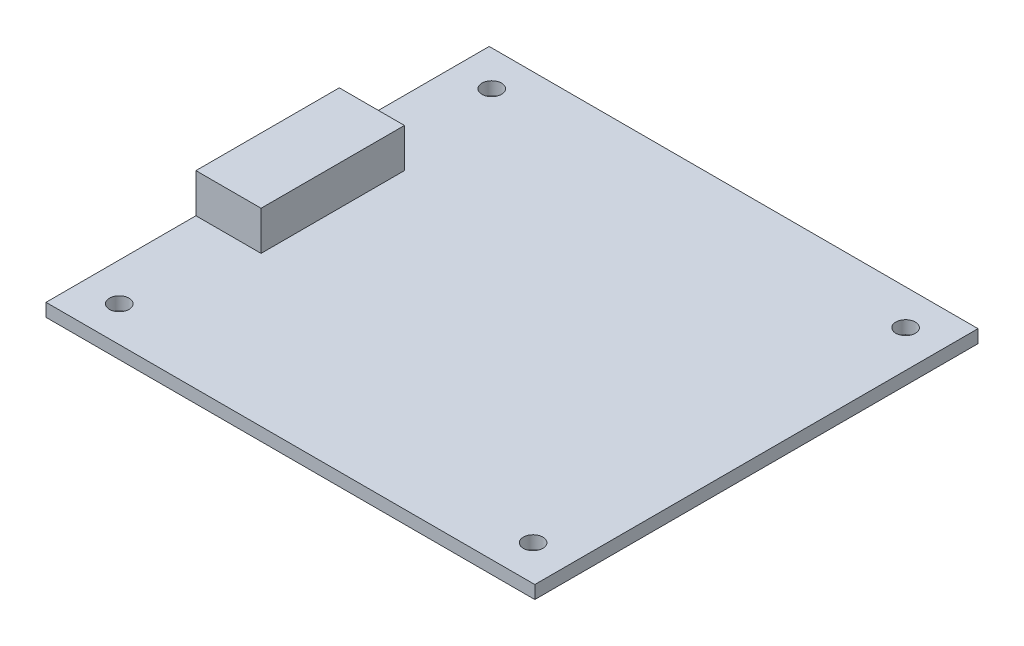
ISO-10303-21;
HEADER;
FILE_DESCRIPTION(('STEP AP214'),'2;1');
FILE_NAME('part.step','',(''),(''),'','','');
FILE_SCHEMA(('AUTOMOTIVE_DESIGN { 1 0 10303 214 1 1 1 1 }'));
ENDSEC;
DATA;
#1=APPLICATION_CONTEXT('core data for automotive mechanical design processes');
#2=APPLICATION_PROTOCOL_DEFINITION('international standard','automotive_design',2000,#1);
#3=PRODUCT_CONTEXT('',#1,'mechanical');
#4=PRODUCT('Part','Part','',(#3));
#5=PRODUCT_RELATED_PRODUCT_CATEGORY('part','',(#4));
#6=PRODUCT_DEFINITION_FORMATION('','',#4);
#7=PRODUCT_DEFINITION_CONTEXT('part definition',#1,'design');
#8=PRODUCT_DEFINITION('design','',#6,#7);
#9=PRODUCT_DEFINITION_SHAPE('','',#8);
#10=(LENGTH_UNIT() NAMED_UNIT(*) SI_UNIT(.MILLI.,.METRE.));
#11=(NAMED_UNIT(*) PLANE_ANGLE_UNIT() SI_UNIT($,.RADIAN.));
#12=(NAMED_UNIT(*) SI_UNIT($,.STERADIAN.) SOLID_ANGLE_UNIT());
#13=UNCERTAINTY_MEASURE_WITH_UNIT(LENGTH_MEASURE(1.E-05),#10,'distance_accuracy_value','');
#14=(GEOMETRIC_REPRESENTATION_CONTEXT(3) GLOBAL_UNCERTAINTY_ASSIGNED_CONTEXT((#13)) GLOBAL_UNIT_ASSIGNED_CONTEXT((#10,
#11,#12)) REPRESENTATION_CONTEXT('',''));
#15=CARTESIAN_POINT('',(0.,0.,0.));
#16=DIRECTION('',(0.,0.,1.));
#17=DIRECTION('',(1.,0.,0.));
#18=AXIS2_PLACEMENT_3D('',#15,#16,#17);
#19=CARTESIAN_POINT('',(0.,2.,0.));
#20=DIRECTION('',(0.,-1.,0.));
#21=DIRECTION('',(0.,0.,-1.));
#22=AXIS2_PLACEMENT_3D('',#19,#20,#21);
#23=PLANE('',#22);
#24=CARTESIAN_POINT('',(-31.6865,2.,28.5750000000001));
#25=DIRECTION('',(0.,1.,0.));
#26=DIRECTION('',(0.,0.,1.));
#27=AXIS2_PLACEMENT_3D('',#24,#25,#26);
#28=CIRCLE('',#27,1.5);
#29=CARTESIAN_POINT('',(-31.6865,2.,30.0750000000001));
#30=VERTEX_POINT('',#29);
#31=EDGE_CURVE('E129',#30,#30,#28,.T.);
#32=ORIENTED_EDGE('',*,*,#31,.F.);
#33=EDGE_LOOP('',(#32));
#34=FACE_BOUND('',#33,.T.);
#35=CARTESIAN_POINT('',(-31.6865000000001,2.,-28.5749999999999));
#36=DIRECTION('',(0.,1.,0.));
#37=DIRECTION('',(0.,0.,1.));
#38=AXIS2_PLACEMENT_3D('',#35,#36,#37);
#39=CIRCLE('',#38,1.5);
#40=CARTESIAN_POINT('',(-31.6865000000001,2.,-27.0749999999999));
#41=VERTEX_POINT('',#40);
#42=EDGE_CURVE('E135',#41,#41,#39,.T.);
#43=ORIENTED_EDGE('',*,*,#42,.F.);
#44=EDGE_LOOP('',(#43));
#45=FACE_BOUND('',#44,.T.);
#46=CARTESIAN_POINT('',(31.8135000000001,2.,28.5749999999999));
#47=DIRECTION('',(0.,1.,0.));
#48=DIRECTION('',(0.,0.,1.));
#49=AXIS2_PLACEMENT_3D('',#46,#47,#48);
#50=CIRCLE('',#49,1.5);
#51=CARTESIAN_POINT('',(31.8135000000001,2.,30.0749999999999));
#52=VERTEX_POINT('',#51);
#53=EDGE_CURVE('E141',#52,#52,#50,.T.);
#54=ORIENTED_EDGE('',*,*,#53,.F.);
#55=EDGE_LOOP('',(#54));
#56=FACE_BOUND('',#55,.T.);
#57=CARTESIAN_POINT('',(31.8134999999999,2.,-28.5750000000001));
#58=DIRECTION('',(0.,1.,0.));
#59=DIRECTION('',(0.,0.,1.));
#60=AXIS2_PLACEMENT_3D('',#57,#58,#59);
#61=CIRCLE('',#60,1.5);
#62=CARTESIAN_POINT('',(31.8134999999999,2.,-27.0750000000001));
#63=VERTEX_POINT('',#62);
#64=EDGE_CURVE('E147',#63,#63,#61,.T.);
#65=ORIENTED_EDGE('',*,*,#64,.F.);
#66=EDGE_LOOP('',(#65));
#67=FACE_BOUND('',#66,.T.);
#68=DIRECTION('',(1.,0.,0.));
#69=VECTOR('',#68,1.);
#70=CARTESIAN_POINT('',(-37.5,2.,11.));
#71=LINE('',#70,#69);
#72=CARTESIAN_POINT('',(-37.5,2.,11.));
#73=VERTEX_POINT('',#72);
#74=CARTESIAN_POINT('',(-27.5,2.,11.));
#75=VERTEX_POINT('',#74);
#76=EDGE_CURVE('E114',#73,#75,#71,.T.);
#77=ORIENTED_EDGE('',*,*,#76,.F.);
#78=DIRECTION('',(0.,0.,1.));
#79=VECTOR('',#78,1.);
#80=CARTESIAN_POINT('',(-37.5,2.,34.));
#81=LINE('',#80,#79);
#82=CARTESIAN_POINT('',(-37.5,2.,34.));
#83=VERTEX_POINT('',#82);
#84=EDGE_CURVE('E159',#73,#83,#81,.T.);
#85=ORIENTED_EDGE('',*,*,#84,.T.);
#86=DIRECTION('',(1.,0.,0.));
#87=VECTOR('',#86,1.);
#88=CARTESIAN_POINT('',(-37.5,2.,34.));
#89=LINE('',#88,#87);
#90=CARTESIAN_POINT('',(37.5,2.,34.));
#91=VERTEX_POINT('',#90);
#92=EDGE_CURVE('E162',#83,#91,#89,.T.);
#93=ORIENTED_EDGE('',*,*,#92,.T.);
#94=DIRECTION('',(0.,0.,-1.));
#95=VECTOR('',#94,1.);
#96=CARTESIAN_POINT('',(37.5,2.,34.));
#97=LINE('',#96,#95);
#98=CARTESIAN_POINT('',(37.5,2.,-34.));
#99=VERTEX_POINT('',#98);
#100=EDGE_CURVE('E153',#91,#99,#97,.T.);
#101=ORIENTED_EDGE('',*,*,#100,.T.);
#102=DIRECTION('',(-1.,0.,0.));
#103=VECTOR('',#102,1.);
#104=CARTESIAN_POINT('',(-37.5,2.,-34.));
#105=LINE('',#104,#103);
#106=CARTESIAN_POINT('',(-37.5,2.,-34.));
#107=VERTEX_POINT('',#106);
#108=EDGE_CURVE('E156',#99,#107,#105,.T.);
#109=ORIENTED_EDGE('',*,*,#108,.T.);
#110=CARTESIAN_POINT('',(-37.5,2.,-11.));
#111=VERTEX_POINT('',#110);
#112=EDGE_CURVE('E160',#107,#111,#81,.T.);
#113=ORIENTED_EDGE('',*,*,#112,.T.);
#114=DIRECTION('',(-1.,0.,0.));
#115=VECTOR('',#114,1.);
#116=CARTESIAN_POINT('',(-37.5,2.,-11.));
#117=LINE('',#116,#115);
#118=CARTESIAN_POINT('',(-27.5,2.,-11.));
#119=VERTEX_POINT('',#118);
#120=EDGE_CURVE('E52',#119,#111,#117,.T.);
#121=ORIENTED_EDGE('',*,*,#120,.F.);
#122=DIRECTION('',(0.,0.,-1.));
#123=VECTOR('',#122,1.);
#124=CARTESIAN_POINT('',(-27.5,2.,11.));
#125=LINE('',#124,#123);
#126=EDGE_CURVE('E47',#75,#119,#125,.T.);
#127=ORIENTED_EDGE('',*,*,#126,.F.);
#128=EDGE_LOOP('',(#77,#85,#93,#101,#109,#113,#121,#127));
#129=FACE_BOUND('',#128,.T.);
#130=ADVANCED_FACE('F32',(#34,#45,#56,#67,#129),#23,.F.);
#131=CARTESIAN_POINT('',(0.,0.,0.));
#132=DIRECTION('',(0.,-1.,0.));
#133=DIRECTION('',(0.,0.,-1.));
#134=AXIS2_PLACEMENT_3D('',#131,#132,#133);
#135=PLANE('',#134);
#136=CARTESIAN_POINT('',(-21.7439228681575,0.,-7.92747187901575));
#137=DIRECTION('',(0.,-1.,0.));
#138=DIRECTION('',(0.,0.,-1.));
#139=AXIS2_PLACEMENT_3D('',#136,#137,#138);
#140=CIRCLE('',#139,2.);
#141=CARTESIAN_POINT('',(-21.7439228681575,0.,-9.92747187901576));
#142=VERTEX_POINT('',#141);
#143=EDGE_CURVE('E117',#142,#142,#140,.T.);
#144=ORIENTED_EDGE('',*,*,#143,.F.);
#145=EDGE_LOOP('',(#144));
#146=FACE_BOUND('',#145,.T.);
#147=CARTESIAN_POINT('',(-21.5929234037953,0.,0.));
#148=DIRECTION('',(0.,-1.,0.));
#149=DIRECTION('',(0.,0.,-1.));
#150=AXIS2_PLACEMENT_3D('',#147,#148,#149);
#151=CIRCLE('',#150,3.);
#152=CARTESIAN_POINT('',(-21.5929234037953,0.,-3.));
#153=VERTEX_POINT('',#152);
#154=EDGE_CURVE('E120',#153,#153,#151,.T.);
#155=ORIENTED_EDGE('',*,*,#154,.F.);
#156=EDGE_LOOP('',(#155));
#157=FACE_BOUND('',#156,.T.);
#158=CARTESIAN_POINT('',(-31.6865000000001,0.,-28.5749999999999));
#159=DIRECTION('',(0.,1.,0.));
#160=DIRECTION('',(0.,0.,1.));
#161=AXIS2_PLACEMENT_3D('',#158,#159,#160);
#162=CIRCLE('',#161,1.5);
#163=CARTESIAN_POINT('',(-31.6865000000001,0.,-27.0749999999999));
#164=VERTEX_POINT('',#163);
#165=EDGE_CURVE('E132',#164,#164,#162,.T.);
#166=ORIENTED_EDGE('',*,*,#165,.T.);
#167=EDGE_LOOP('',(#166));
#168=FACE_BOUND('',#167,.T.);
#169=CARTESIAN_POINT('',(31.8134999999999,0.,-28.5750000000001));
#170=DIRECTION('',(0.,1.,0.));
#171=DIRECTION('',(0.,0.,1.));
#172=AXIS2_PLACEMENT_3D('',#169,#170,#171);
#173=CIRCLE('',#172,1.5);
#174=CARTESIAN_POINT('',(31.8134999999999,0.,-27.0750000000001));
#175=VERTEX_POINT('',#174);
#176=EDGE_CURVE('E144',#175,#175,#173,.T.);
#177=ORIENTED_EDGE('',*,*,#176,.T.);
#178=EDGE_LOOP('',(#177));
#179=FACE_BOUND('',#178,.T.);
#180=DIRECTION('',(0.,0.,-1.));
#181=VECTOR('',#180,1.);
#182=CARTESIAN_POINT('',(37.5,0.,34.));
#183=LINE('',#182,#181);
#184=CARTESIAN_POINT('',(37.5,0.,34.));
#185=VERTEX_POINT('',#184);
#186=CARTESIAN_POINT('',(37.5,0.,-34.));
#187=VERTEX_POINT('',#186);
#188=EDGE_CURVE('E150',#185,#187,#183,.T.);
#189=ORIENTED_EDGE('',*,*,#188,.F.);
#190=DIRECTION('',(1.,0.,0.));
#191=VECTOR('',#190,1.);
#192=CARTESIAN_POINT('',(-37.5,0.,34.));
#193=LINE('',#192,#191);
#194=CARTESIAN_POINT('',(-37.5,0.,34.));
#195=VERTEX_POINT('',#194);
#196=EDGE_CURVE('E157',#195,#185,#193,.T.);
#197=ORIENTED_EDGE('',*,*,#196,.F.);
#198=DIRECTION('',(0.,0.,1.));
#199=VECTOR('',#198,1.);
#200=CARTESIAN_POINT('',(-37.5,0.,34.));
#201=LINE('',#200,#199);
#202=CARTESIAN_POINT('',(-37.5,0.,-34.));
#203=VERTEX_POINT('',#202);
#204=EDGE_CURVE('E169',#203,#195,#201,.T.);
#205=ORIENTED_EDGE('',*,*,#204,.F.);
#206=DIRECTION('',(-1.,0.,0.));
#207=VECTOR('',#206,1.);
#208=CARTESIAN_POINT('',(-37.5,0.,-34.));
#209=LINE('',#208,#207);
#210=EDGE_CURVE('E167',#187,#203,#209,.T.);
#211=ORIENTED_EDGE('',*,*,#210,.F.);
#212=EDGE_LOOP('',(#189,#197,#205,#211));
#213=FACE_BOUND('',#212,.T.);
#214=CARTESIAN_POINT('',(31.8135000000001,0.,28.5749999999999));
#215=DIRECTION('',(0.,1.,0.));
#216=DIRECTION('',(0.,0.,1.));
#217=AXIS2_PLACEMENT_3D('',#214,#215,#216);
#218=CIRCLE('',#217,1.5);
#219=CARTESIAN_POINT('',(31.8135000000001,0.,30.0749999999999));
#220=VERTEX_POINT('',#219);
#221=EDGE_CURVE('E138',#220,#220,#218,.T.);
#222=ORIENTED_EDGE('',*,*,#221,.T.);
#223=EDGE_LOOP('',(#222));
#224=FACE_BOUND('',#223,.T.);
#225=CARTESIAN_POINT('',(-31.6865,0.,28.5750000000001));
#226=DIRECTION('',(0.,1.,0.));
#227=DIRECTION('',(0.,0.,1.));
#228=AXIS2_PLACEMENT_3D('',#225,#226,#227);
#229=CIRCLE('',#228,1.5);
#230=CARTESIAN_POINT('',(-31.6865,0.,30.0750000000001));
#231=VERTEX_POINT('',#230);
#232=EDGE_CURVE('E128',#231,#231,#229,.T.);
#233=ORIENTED_EDGE('',*,*,#232,.T.);
#234=EDGE_LOOP('',(#233));
#235=FACE_BOUND('',#234,.T.);
#236=ADVANCED_FACE('F205',(#146,#157,#168,#179,#213,#224,#235),#135,.T.);
#237=CARTESIAN_POINT('',(37.5,2.,34.));
#238=DIRECTION('',(-1.,0.,0.));
#239=DIRECTION('',(0.,0.,1.));
#240=AXIS2_PLACEMENT_3D('',#237,#238,#239);
#241=PLANE('',#240);
#242=ORIENTED_EDGE('',*,*,#188,.T.);
#243=DIRECTION('',(0.,-1.,0.));
#244=VECTOR('',#243,1.);
#245=CARTESIAN_POINT('',(37.5,2.,-34.));
#246=LINE('',#245,#244);
#247=EDGE_CURVE('E180',#99,#187,#246,.T.);
#248=ORIENTED_EDGE('',*,*,#247,.F.);
#249=ORIENTED_EDGE('',*,*,#100,.F.);
#250=DIRECTION('',(0.,-1.,0.));
#251=VECTOR('',#250,1.);
#252=CARTESIAN_POINT('',(37.5,2.,34.));
#253=LINE('',#252,#251);
#254=EDGE_CURVE('E164',#91,#185,#253,.T.);
#255=ORIENTED_EDGE('',*,*,#254,.T.);
#256=EDGE_LOOP('',(#242,#248,#249,#255));
#257=FACE_BOUND('',#256,.T.);
#258=ADVANCED_FACE('F211',(#257),#241,.F.);
#259=CARTESIAN_POINT('',(-37.5,2.,-34.));
#260=DIRECTION('',(0.,0.,1.));
#261=DIRECTION('',(1.,0.,0.));
#262=AXIS2_PLACEMENT_3D('',#259,#260,#261);
#263=PLANE('',#262);
#264=ORIENTED_EDGE('',*,*,#210,.T.);
#265=DIRECTION('',(0.,-1.,0.));
#266=VECTOR('',#265,1.);
#267=CARTESIAN_POINT('',(-37.5,2.,-34.));
#268=LINE('',#267,#266);
#269=EDGE_CURVE('E177',#107,#203,#268,.T.);
#270=ORIENTED_EDGE('',*,*,#269,.F.);
#271=ORIENTED_EDGE('',*,*,#108,.F.);
#272=ORIENTED_EDGE('',*,*,#247,.T.);
#273=EDGE_LOOP('',(#264,#270,#271,#272));
#274=FACE_BOUND('',#273,.T.);
#275=ADVANCED_FACE('F227',(#274),#263,.F.);
#276=CARTESIAN_POINT('',(-37.5,2.,34.));
#277=DIRECTION('',(1.,0.,0.));
#278=DIRECTION('',(0.,0.,-1.));
#279=AXIS2_PLACEMENT_3D('',#276,#277,#278);
#280=PLANE('',#279);
#281=ORIENTED_EDGE('',*,*,#204,.T.);
#282=DIRECTION('',(0.,-1.,0.));
#283=VECTOR('',#282,1.);
#284=CARTESIAN_POINT('',(-37.5,2.,34.));
#285=LINE('',#284,#283);
#286=EDGE_CURVE('E174',#83,#195,#285,.T.);
#287=ORIENTED_EDGE('',*,*,#286,.F.);
#288=ORIENTED_EDGE('',*,*,#84,.F.);
#289=DIRECTION('',(0.,-1.,0.));
#290=VECTOR('',#289,1.);
#291=CARTESIAN_POINT('',(-37.5,8.,11.));
#292=LINE('',#291,#290);
#293=CARTESIAN_POINT('',(-37.5,8.,11.));
#294=VERTEX_POINT('',#293);
#295=EDGE_CURVE('E122',#294,#73,#292,.T.);
#296=ORIENTED_EDGE('',*,*,#295,.F.);
#297=DIRECTION('',(0.,0.,1.));
#298=VECTOR('',#297,1.);
#299=CARTESIAN_POINT('',(-37.5,8.,11.));
#300=LINE('',#299,#298);
#301=CARTESIAN_POINT('',(-37.5,8.,-11.));
#302=VERTEX_POINT('',#301);
#303=EDGE_CURVE('E104',#302,#294,#300,.T.);
#304=ORIENTED_EDGE('',*,*,#303,.F.);
#305=DIRECTION('',(0.,-1.,0.));
#306=VECTOR('',#305,1.);
#307=CARTESIAN_POINT('',(-37.5,8.,-11.));
#308=LINE('',#307,#306);
#309=EDGE_CURVE('E101',#302,#111,#308,.T.);
#310=ORIENTED_EDGE('',*,*,#309,.T.);
#311=ORIENTED_EDGE('',*,*,#112,.F.);
#312=ORIENTED_EDGE('',*,*,#269,.T.);
#313=EDGE_LOOP('',(#281,#287,#288,#296,#304,#310,#311,#312));
#314=FACE_BOUND('',#313,.T.);
#315=ADVANCED_FACE('F223',(#314),#280,.F.);
#316=CARTESIAN_POINT('',(-37.5,2.,34.));
#317=DIRECTION('',(0.,0.,-1.));
#318=DIRECTION('',(-1.,0.,0.));
#319=AXIS2_PLACEMENT_3D('',#316,#317,#318);
#320=PLANE('',#319);
#321=ORIENTED_EDGE('',*,*,#196,.T.);
#322=ORIENTED_EDGE('',*,*,#254,.F.);
#323=ORIENTED_EDGE('',*,*,#92,.F.);
#324=ORIENTED_EDGE('',*,*,#286,.T.);
#325=EDGE_LOOP('',(#321,#322,#323,#324));
#326=FACE_BOUND('',#325,.T.);
#327=ADVANCED_FACE('F220',(#326),#320,.F.);
#328=CARTESIAN_POINT('',(31.8134999999999,2.,-28.5750000000001));
#329=DIRECTION('',(0.,-1.,0.));
#330=DIRECTION('',(0.,0.,-1.));
#331=AXIS2_PLACEMENT_3D('',#328,#329,#330);
#332=CYLINDRICAL_SURFACE('',#331,1.5);
#333=ORIENTED_EDGE('',*,*,#64,.T.);
#334=EDGE_LOOP('',(#333));
#335=FACE_BOUND('',#334,.T.);
#336=ORIENTED_EDGE('',*,*,#176,.F.);
#337=EDGE_LOOP('',(#336));
#338=FACE_BOUND('',#337,.T.);
#339=ADVANCED_FACE('F217',(#335,#338),#332,.F.);
#340=CARTESIAN_POINT('',(31.8135000000001,2.,28.5749999999999));
#341=DIRECTION('',(0.,-1.,0.));
#342=DIRECTION('',(0.,0.,-1.));
#343=AXIS2_PLACEMENT_3D('',#340,#341,#342);
#344=CYLINDRICAL_SURFACE('',#343,1.5);
#345=ORIENTED_EDGE('',*,*,#53,.T.);
#346=EDGE_LOOP('',(#345));
#347=FACE_BOUND('',#346,.T.);
#348=ORIENTED_EDGE('',*,*,#221,.F.);
#349=EDGE_LOOP('',(#348));
#350=FACE_BOUND('',#349,.T.);
#351=ADVANCED_FACE('F288',(#347,#350),#344,.F.);
#352=CARTESIAN_POINT('',(-31.6865000000001,2.,-28.5749999999999));
#353=DIRECTION('',(0.,-1.,0.));
#354=DIRECTION('',(0.,0.,-1.));
#355=AXIS2_PLACEMENT_3D('',#352,#353,#354);
#356=CYLINDRICAL_SURFACE('',#355,1.5);
#357=ORIENTED_EDGE('',*,*,#42,.T.);
#358=EDGE_LOOP('',(#357));
#359=FACE_BOUND('',#358,.T.);
#360=ORIENTED_EDGE('',*,*,#165,.F.);
#361=EDGE_LOOP('',(#360));
#362=FACE_BOUND('',#361,.T.);
#363=ADVANCED_FACE('F285',(#359,#362),#356,.F.);
#364=CARTESIAN_POINT('',(-31.6865,2.,28.5750000000001));
#365=DIRECTION('',(0.,-1.,0.));
#366=DIRECTION('',(0.,0.,-1.));
#367=AXIS2_PLACEMENT_3D('',#364,#365,#366);
#368=CYLINDRICAL_SURFACE('',#367,1.5);
#369=ORIENTED_EDGE('',*,*,#31,.T.);
#370=EDGE_LOOP('',(#369));
#371=FACE_BOUND('',#370,.T.);
#372=ORIENTED_EDGE('',*,*,#232,.F.);
#373=EDGE_LOOP('',(#372));
#374=FACE_BOUND('',#373,.T.);
#375=ADVANCED_FACE('F281',(#371,#374),#368,.F.);
#376=CARTESIAN_POINT('',(-21.5929234037953,-10.,0.));
#377=DIRECTION('',(0.,1.,0.));
#378=DIRECTION('',(0.,0.,1.));
#379=AXIS2_PLACEMENT_3D('',#376,#377,#378);
#380=CYLINDRICAL_SURFACE('',#379,3.);
#381=CARTESIAN_POINT('',(-21.5929234037953,-9.7,0.));
#382=DIRECTION('',(0.,-1.,0.));
#383=DIRECTION('',(0.,0.,-1.));
#384=AXIS2_PLACEMENT_3D('',#381,#382,#383);
#385=CIRCLE('',#384,3.);
#386=CARTESIAN_POINT('',(-21.5929234037953,-9.7,-3.));
#387=VERTEX_POINT('',#386);
#388=EDGE_CURVE('E11',#387,#387,#385,.F.);
#389=ORIENTED_EDGE('',*,*,#388,.T.);
#390=EDGE_LOOP('',(#389));
#391=FACE_BOUND('',#390,.T.);
#392=ORIENTED_EDGE('',*,*,#154,.T.);
#393=EDGE_LOOP('',(#392));
#394=FACE_BOUND('',#393,.T.);
#395=ADVANCED_FACE('F278',(#391,#394),#380,.T.);
#396=CARTESIAN_POINT('',(-21.5929234037953,-10.,0.));
#397=DIRECTION('',(0.,-1.,0.));
#398=DIRECTION('',(0.,0.,-1.));
#399=AXIS2_PLACEMENT_3D('',#396,#397,#398);
#400=PLANE('',#399);
#401=CARTESIAN_POINT('',(-21.5929234037953,-10.,0.));
#402=DIRECTION('',(0.,-1.,0.));
#403=DIRECTION('',(0.,0.,-1.));
#404=AXIS2_PLACEMENT_3D('',#401,#402,#403);
#405=CIRCLE('',#404,2.7);
#406=CARTESIAN_POINT('',(-21.5929234037953,-10.,-2.7));
#407=VERTEX_POINT('',#406);
#408=EDGE_CURVE('E40',#407,#407,#405,.T.);
#409=ORIENTED_EDGE('',*,*,#408,.T.);
#410=EDGE_LOOP('',(#409));
#411=FACE_BOUND('',#410,.T.);
#412=ADVANCED_FACE('F191',(#411),#400,.T.);
#413=CARTESIAN_POINT('',(-21.7439228681575,-8.,-7.92747187901575));
#414=DIRECTION('',(0.,1.,0.));
#415=DIRECTION('',(0.,0.,1.));
#416=AXIS2_PLACEMENT_3D('',#413,#414,#415);
#417=CYLINDRICAL_SURFACE('',#416,2.);
#418=CARTESIAN_POINT('',(-21.7439228681575,-7.7,-7.92747187901575));
#419=DIRECTION('',(0.,-1.,0.));
#420=DIRECTION('',(0.,0.,-1.));
#421=AXIS2_PLACEMENT_3D('',#418,#419,#420);
#422=CIRCLE('',#421,2.);
#423=CARTESIAN_POINT('',(-21.7439228681575,-7.7,-9.92747187901576));
#424=VERTEX_POINT('',#423);
#425=EDGE_CURVE('E186',#424,#424,#422,.F.);
#426=ORIENTED_EDGE('',*,*,#425,.T.);
#427=EDGE_LOOP('',(#426));
#428=FACE_BOUND('',#427,.T.);
#429=ORIENTED_EDGE('',*,*,#143,.T.);
#430=EDGE_LOOP('',(#429));
#431=FACE_BOUND('',#430,.T.);
#432=ADVANCED_FACE('F271',(#428,#431),#417,.T.);
#433=CARTESIAN_POINT('',(-21.7439228681575,-8.,-7.92747187901575));
#434=DIRECTION('',(0.,-1.,0.));
#435=DIRECTION('',(0.,0.,-1.));
#436=AXIS2_PLACEMENT_3D('',#433,#434,#435);
#437=PLANE('',#436);
#438=CARTESIAN_POINT('',(-21.7439228681575,-8.,-7.92747187901575));
#439=DIRECTION('',(0.,-1.,0.));
#440=DIRECTION('',(0.,0.,-1.));
#441=AXIS2_PLACEMENT_3D('',#438,#439,#440);
#442=CIRCLE('',#441,1.7);
#443=CARTESIAN_POINT('',(-21.7439228681575,-8.,-9.62747187901576));
#444=VERTEX_POINT('',#443);
#445=EDGE_CURVE('E183',#444,#444,#442,.T.);
#446=ORIENTED_EDGE('',*,*,#445,.T.);
#447=EDGE_LOOP('',(#446));
#448=FACE_BOUND('',#447,.T.);
#449=ADVANCED_FACE('F201',(#448),#437,.T.);
#450=CARTESIAN_POINT('',(-21.7439228681575,-7.7,-7.92747187901575));
#451=DIRECTION('',(0.,-1.,0.));
#452=DIRECTION('',(0.,0.,-1.));
#453=AXIS2_PLACEMENT_3D('',#450,#451,#452);
#454=TOROIDAL_SURFACE('',#453,1.7,0.3);
#455=ORIENTED_EDGE('',*,*,#425,.F.);
#456=EDGE_LOOP('',(#455));
#457=FACE_BOUND('',#456,.T.);
#458=ORIENTED_EDGE('',*,*,#445,.F.);
#459=EDGE_LOOP('',(#458));
#460=FACE_BOUND('',#459,.T.);
#461=ADVANCED_FACE('F194',(#457,#460),#454,.T.);
#462=CARTESIAN_POINT('',(-21.5929234037953,-9.7,0.));
#463=DIRECTION('',(0.,-1.,0.));
#464=DIRECTION('',(0.,0.,-1.));
#465=AXIS2_PLACEMENT_3D('',#462,#463,#464);
#466=TOROIDAL_SURFACE('',#465,2.7,0.3);
#467=ORIENTED_EDGE('',*,*,#388,.F.);
#468=EDGE_LOOP('',(#467));
#469=FACE_BOUND('',#468,.T.);
#470=ORIENTED_EDGE('',*,*,#408,.F.);
#471=EDGE_LOOP('',(#470));
#472=FACE_BOUND('',#471,.T.);
#473=ADVANCED_FACE('F34',(#469,#472),#466,.T.);
#474=CARTESIAN_POINT('',(-27.5,8.,11.));
#475=DIRECTION('',(-1.,0.,0.));
#476=DIRECTION('',(0.,0.,1.));
#477=AXIS2_PLACEMENT_3D('',#474,#475,#476);
#478=PLANE('',#477);
#479=ORIENTED_EDGE('',*,*,#126,.T.);
#480=DIRECTION('',(0.,-1.,0.));
#481=VECTOR('',#480,1.);
#482=CARTESIAN_POINT('',(-27.5,8.,-11.));
#483=LINE('',#482,#481);
#484=CARTESIAN_POINT('',(-27.5,8.,-11.));
#485=VERTEX_POINT('',#484);
#486=EDGE_CURVE('E99',#485,#119,#483,.T.);
#487=ORIENTED_EDGE('',*,*,#486,.F.);
#488=DIRECTION('',(0.,0.,-1.));
#489=VECTOR('',#488,1.);
#490=CARTESIAN_POINT('',(-27.5,8.,11.));
#491=LINE('',#490,#489);
#492=CARTESIAN_POINT('',(-27.5,8.,11.));
#493=VERTEX_POINT('',#492);
#494=EDGE_CURVE('E105',#493,#485,#491,.T.);
#495=ORIENTED_EDGE('',*,*,#494,.F.);
#496=DIRECTION('',(0.,-1.,0.));
#497=VECTOR('',#496,1.);
#498=CARTESIAN_POINT('',(-27.5,8.,11.));
#499=LINE('',#498,#497);
#500=EDGE_CURVE('E256',#493,#75,#499,.T.);
#501=ORIENTED_EDGE('',*,*,#500,.T.);
#502=EDGE_LOOP('',(#479,#487,#495,#501));
#503=FACE_BOUND('',#502,.T.);
#504=ADVANCED_FACE('F116',(#503),#478,.F.);
#505=CARTESIAN_POINT('',(-37.5,8.,-11.));
#506=DIRECTION('',(0.,0.,1.));
#507=DIRECTION('',(1.,0.,0.));
#508=AXIS2_PLACEMENT_3D('',#505,#506,#507);
#509=PLANE('',#508);
#510=ORIENTED_EDGE('',*,*,#120,.T.);
#511=ORIENTED_EDGE('',*,*,#309,.F.);
#512=DIRECTION('',(-1.,0.,0.));
#513=VECTOR('',#512,1.);
#514=CARTESIAN_POINT('',(-37.5,8.,-11.));
#515=LINE('',#514,#513);
#516=EDGE_CURVE('E95',#485,#302,#515,.T.);
#517=ORIENTED_EDGE('',*,*,#516,.F.);
#518=ORIENTED_EDGE('',*,*,#486,.T.);
#519=EDGE_LOOP('',(#510,#511,#517,#518));
#520=FACE_BOUND('',#519,.T.);
#521=ADVANCED_FACE('F97',(#520),#509,.F.);
#522=CARTESIAN_POINT('',(-37.5,8.,11.));
#523=DIRECTION('',(0.,0.,-1.));
#524=DIRECTION('',(-1.,0.,0.));
#525=AXIS2_PLACEMENT_3D('',#522,#523,#524);
#526=PLANE('',#525);
#527=ORIENTED_EDGE('',*,*,#76,.T.);
#528=ORIENTED_EDGE('',*,*,#500,.F.);
#529=DIRECTION('',(1.,0.,0.));
#530=VECTOR('',#529,1.);
#531=CARTESIAN_POINT('',(-37.5,8.,11.));
#532=LINE('',#531,#530);
#533=EDGE_CURVE('E110',#294,#493,#532,.T.);
#534=ORIENTED_EDGE('',*,*,#533,.F.);
#535=ORIENTED_EDGE('',*,*,#295,.T.);
#536=EDGE_LOOP('',(#527,#528,#534,#535));
#537=FACE_BOUND('',#536,.T.);
#538=ADVANCED_FACE('F258',(#537),#526,.F.);
#539=CARTESIAN_POINT('',(0.,8.,0.));
#540=DIRECTION('',(0.,-1.,0.));
#541=DIRECTION('',(0.,0.,-1.));
#542=AXIS2_PLACEMENT_3D('',#539,#540,#541);
#543=PLANE('',#542);
#544=ORIENTED_EDGE('',*,*,#494,.T.);
#545=ORIENTED_EDGE('',*,*,#516,.T.);
#546=ORIENTED_EDGE('',*,*,#303,.T.);
#547=ORIENTED_EDGE('',*,*,#533,.T.);
#548=EDGE_LOOP('',(#544,#545,#546,#547));
#549=FACE_BOUND('',#548,.T.);
#550=ADVANCED_FACE('F108',(#549),#543,.F.);
#551=CLOSED_SHELL('',(#130,#236,#258,#275,#315,#327,#339,#351,#363,#375,#395,#412,#432,#449,
#461,#473,#504,#521,#538,#550));
#552=MANIFOLD_SOLID_BREP('B2',#551);
#553=ADVANCED_BREP_SHAPE_REPRESENTATION('',(#18,#552),#14);
#554=SHAPE_DEFINITION_REPRESENTATION(#9,#553);
ENDSEC;
END-ISO-10303-21;
